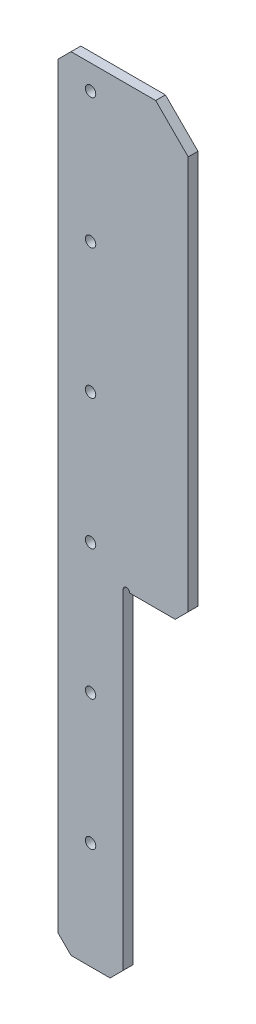
ISO-10303-21;
HEADER;
FILE_DESCRIPTION(('STEP AP214'),'2;1');
FILE_NAME('part.step','',(''),(''),'','','');
FILE_SCHEMA(('AUTOMOTIVE_DESIGN { 1 0 10303 214 1 1 1 1 }'));
ENDSEC;
DATA;
#1=APPLICATION_CONTEXT('core data for automotive mechanical design processes');
#2=APPLICATION_PROTOCOL_DEFINITION('international standard','automotive_design',2000,#1);
#3=PRODUCT_CONTEXT('',#1,'mechanical');
#4=PRODUCT('Part','Part','',(#3));
#5=PRODUCT_RELATED_PRODUCT_CATEGORY('part','',(#4));
#6=PRODUCT_DEFINITION_FORMATION('','',#4);
#7=PRODUCT_DEFINITION_CONTEXT('part definition',#1,'design');
#8=PRODUCT_DEFINITION('design','',#6,#7);
#9=PRODUCT_DEFINITION_SHAPE('','',#8);
#10=(LENGTH_UNIT() NAMED_UNIT(*) SI_UNIT(.MILLI.,.METRE.));
#11=(NAMED_UNIT(*) PLANE_ANGLE_UNIT() SI_UNIT($,.RADIAN.));
#12=(NAMED_UNIT(*) SI_UNIT($,.STERADIAN.) SOLID_ANGLE_UNIT());
#13=UNCERTAINTY_MEASURE_WITH_UNIT(LENGTH_MEASURE(1.E-05),#10,'distance_accuracy_value','');
#14=(GEOMETRIC_REPRESENTATION_CONTEXT(3) GLOBAL_UNCERTAINTY_ASSIGNED_CONTEXT((#13)) GLOBAL_UNIT_ASSIGNED_CONTEXT((#10,
#11,#12)) REPRESENTATION_CONTEXT('',''));
#15=CARTESIAN_POINT('',(0.,0.,0.));
#16=DIRECTION('',(0.,0.,1.));
#17=DIRECTION('',(1.,0.,0.));
#18=AXIS2_PLACEMENT_3D('',#15,#16,#17);
#19=CARTESIAN_POINT('',(-10.,-72.5,-1.5));
#20=DIRECTION('',(0.,0.,1.));
#21=DIRECTION('',(1.,0.,0.));
#22=AXIS2_PLACEMENT_3D('',#19,#20,#21);
#23=CYLINDRICAL_SURFACE('',#22,1.6);
#24=CARTESIAN_POINT('',(-10.,-72.5,-1.5));
#25=DIRECTION('',(0.,0.,1.));
#26=DIRECTION('',(1.,0.,0.));
#27=AXIS2_PLACEMENT_3D('',#24,#25,#26);
#28=CIRCLE('',#27,1.6);
#29=CARTESIAN_POINT('',(-8.40000000000002,-72.5,-1.5));
#30=VERTEX_POINT('',#29);
#31=EDGE_CURVE('E186',#30,#30,#28,.T.);
#32=ORIENTED_EDGE('',*,*,#31,.F.);
#33=EDGE_LOOP('',(#32));
#34=FACE_BOUND('',#33,.T.);
#35=CARTESIAN_POINT('',(-10.,-72.5,1.5));
#36=DIRECTION('',(0.,0.,1.));
#37=DIRECTION('',(1.,0.,0.));
#38=AXIS2_PLACEMENT_3D('',#35,#36,#37);
#39=CIRCLE('',#38,1.6);
#40=CARTESIAN_POINT('',(-8.40000000000002,-72.5,1.5));
#41=VERTEX_POINT('',#40);
#42=EDGE_CURVE('E189',#41,#41,#39,.T.);
#43=ORIENTED_EDGE('',*,*,#42,.T.);
#44=EDGE_LOOP('',(#43));
#45=FACE_BOUND('',#44,.T.);
#46=ADVANCED_FACE('F39',(#34,#45),#23,.F.);
#47=CARTESIAN_POINT('',(-10.,-32.5,-1.5));
#48=DIRECTION('',(0.,0.,1.));
#49=DIRECTION('',(1.,0.,0.));
#50=AXIS2_PLACEMENT_3D('',#47,#48,#49);
#51=CYLINDRICAL_SURFACE('',#50,1.6);
#52=CARTESIAN_POINT('',(-10.,-32.5,-1.5));
#53=DIRECTION('',(0.,0.,1.));
#54=DIRECTION('',(1.,0.,0.));
#55=AXIS2_PLACEMENT_3D('',#52,#53,#54);
#56=CIRCLE('',#55,1.6);
#57=CARTESIAN_POINT('',(-8.40000000000002,-32.5,-1.5));
#58=VERTEX_POINT('',#57);
#59=EDGE_CURVE('E180',#58,#58,#56,.T.);
#60=ORIENTED_EDGE('',*,*,#59,.F.);
#61=EDGE_LOOP('',(#60));
#62=FACE_BOUND('',#61,.T.);
#63=CARTESIAN_POINT('',(-10.,-32.5,1.5));
#64=DIRECTION('',(0.,0.,1.));
#65=DIRECTION('',(1.,0.,0.));
#66=AXIS2_PLACEMENT_3D('',#63,#64,#65);
#67=CIRCLE('',#66,1.6);
#68=CARTESIAN_POINT('',(-8.40000000000002,-32.5,1.5));
#69=VERTEX_POINT('',#68);
#70=EDGE_CURVE('E183',#69,#69,#67,.T.);
#71=ORIENTED_EDGE('',*,*,#70,.T.);
#72=EDGE_LOOP('',(#71));
#73=FACE_BOUND('',#72,.T.);
#74=ADVANCED_FACE('F292',(#62,#73),#51,.F.);
#75=CARTESIAN_POINT('',(-10.,7.50000000000001,-1.5));
#76=DIRECTION('',(0.,0.,1.));
#77=DIRECTION('',(1.,0.,0.));
#78=AXIS2_PLACEMENT_3D('',#75,#76,#77);
#79=CYLINDRICAL_SURFACE('',#78,1.6);
#80=CARTESIAN_POINT('',(-10.,7.50000000000001,-1.5));
#81=DIRECTION('',(0.,0.,1.));
#82=DIRECTION('',(1.,0.,0.));
#83=AXIS2_PLACEMENT_3D('',#80,#81,#82);
#84=CIRCLE('',#83,1.6);
#85=CARTESIAN_POINT('',(-8.40000000000001,7.50000000000001,-1.5));
#86=VERTEX_POINT('',#85);
#87=EDGE_CURVE('E174',#86,#86,#84,.T.);
#88=ORIENTED_EDGE('',*,*,#87,.F.);
#89=EDGE_LOOP('',(#88));
#90=FACE_BOUND('',#89,.T.);
#91=CARTESIAN_POINT('',(-10.,7.50000000000001,1.5));
#92=DIRECTION('',(0.,0.,1.));
#93=DIRECTION('',(1.,0.,0.));
#94=AXIS2_PLACEMENT_3D('',#91,#92,#93);
#95=CIRCLE('',#94,1.6);
#96=CARTESIAN_POINT('',(-8.40000000000001,7.50000000000001,1.5));
#97=VERTEX_POINT('',#96);
#98=EDGE_CURVE('E177',#97,#97,#95,.T.);
#99=ORIENTED_EDGE('',*,*,#98,.T.);
#100=EDGE_LOOP('',(#99));
#101=FACE_BOUND('',#100,.T.);
#102=ADVANCED_FACE('F298',(#90,#101),#79,.F.);
#103=CARTESIAN_POINT('',(-10.,47.5,-1.5));
#104=DIRECTION('',(0.,0.,1.));
#105=DIRECTION('',(1.,0.,0.));
#106=AXIS2_PLACEMENT_3D('',#103,#104,#105);
#107=CYLINDRICAL_SURFACE('',#106,1.6);
#108=CARTESIAN_POINT('',(-10.,47.5,-1.5));
#109=DIRECTION('',(0.,0.,1.));
#110=DIRECTION('',(1.,0.,0.));
#111=AXIS2_PLACEMENT_3D('',#108,#109,#110);
#112=CIRCLE('',#111,1.6);
#113=CARTESIAN_POINT('',(-8.40000000000001,47.5,-1.5));
#114=VERTEX_POINT('',#113);
#115=EDGE_CURVE('E167',#114,#114,#112,.T.);
#116=ORIENTED_EDGE('',*,*,#115,.F.);
#117=EDGE_LOOP('',(#116));
#118=FACE_BOUND('',#117,.T.);
#119=CARTESIAN_POINT('',(-10.,47.5,1.5));
#120=DIRECTION('',(0.,0.,1.));
#121=DIRECTION('',(1.,0.,0.));
#122=AXIS2_PLACEMENT_3D('',#119,#120,#121);
#123=CIRCLE('',#122,1.6);
#124=CARTESIAN_POINT('',(-8.40000000000001,47.5,1.5));
#125=VERTEX_POINT('',#124);
#126=EDGE_CURVE('E171',#125,#125,#123,.T.);
#127=ORIENTED_EDGE('',*,*,#126,.T.);
#128=EDGE_LOOP('',(#127));
#129=FACE_BOUND('',#128,.T.);
#130=ADVANCED_FACE('F359',(#118,#129),#107,.F.);
#131=CARTESIAN_POINT('',(20.,135.,1.5));
#132=DIRECTION('',(0.,-1.,0.));
#133=DIRECTION('',(0.,0.,-1.));
#134=AXIS2_PLACEMENT_3D('',#131,#132,#133);
#135=PLANE('',#134);
#136=DIRECTION('',(-1.,0.,0.));
#137=VECTOR('',#136,1.);
#138=CARTESIAN_POINT('',(20.,135.,-1.5));
#139=LINE('',#138,#137);
#140=CARTESIAN_POINT('',(10.,135.,-1.5));
#141=VERTEX_POINT('',#140);
#142=CARTESIAN_POINT('',(-16.,135.,-1.5));
#143=VERTEX_POINT('',#142);
#144=EDGE_CURVE('E253',#141,#143,#139,.T.);
#145=ORIENTED_EDGE('',*,*,#144,.T.);
#146=DIRECTION('',(0.,0.,1.));
#147=VECTOR('',#146,1.);
#148=CARTESIAN_POINT('',(-16.,135.,1.5));
#149=LINE('',#148,#147);
#150=CARTESIAN_POINT('',(-16.,135.,1.5));
#151=VERTEX_POINT('',#150);
#152=EDGE_CURVE('E11',#143,#151,#149,.T.);
#153=ORIENTED_EDGE('',*,*,#152,.T.);
#154=DIRECTION('',(-1.,0.,0.));
#155=VECTOR('',#154,1.);
#156=CARTESIAN_POINT('',(20.,135.,1.5));
#157=LINE('',#156,#155);
#158=CARTESIAN_POINT('',(10.,135.,1.5));
#159=VERTEX_POINT('',#158);
#160=EDGE_CURVE('E160',#159,#151,#157,.T.);
#161=ORIENTED_EDGE('',*,*,#160,.F.);
#162=DIRECTION('',(0.,0.,-1.));
#163=VECTOR('',#162,1.);
#164=CARTESIAN_POINT('',(10.,135.,1.5));
#165=LINE('',#164,#163);
#166=EDGE_CURVE('E192',#159,#141,#165,.T.);
#167=ORIENTED_EDGE('',*,*,#166,.T.);
#168=EDGE_LOOP('',(#145,#153,#161,#167));
#169=FACE_BOUND('',#168,.T.);
#170=ADVANCED_FACE('F333',(#169),#135,.F.);
#171=CARTESIAN_POINT('',(-20.,135.,1.5));
#172=DIRECTION('',(1.,0.,0.));
#173=DIRECTION('',(0.,1.,0.));
#174=AXIS2_PLACEMENT_3D('',#171,#172,#173);
#175=PLANE('',#174);
#176=DIRECTION('',(0.,-1.,0.));
#177=VECTOR('',#176,1.);
#178=CARTESIAN_POINT('',(-20.,135.,-1.5));
#179=LINE('',#178,#177);
#180=CARTESIAN_POINT('',(-20.,131.,-1.5));
#181=VERTEX_POINT('',#180);
#182=CARTESIAN_POINT('',(-20.,-101.4,-1.5));
#183=VERTEX_POINT('',#182);
#184=EDGE_CURVE('E240',#181,#183,#179,.T.);
#185=ORIENTED_EDGE('',*,*,#184,.T.);
#186=DIRECTION('',(0.,0.,1.));
#187=VECTOR('',#186,1.);
#188=CARTESIAN_POINT('',(-20.,-101.4,1.5));
#189=LINE('',#188,#187);
#190=CARTESIAN_POINT('',(-20.,-101.4,1.5));
#191=VERTEX_POINT('',#190);
#192=EDGE_CURVE('E48',#183,#191,#189,.T.);
#193=ORIENTED_EDGE('',*,*,#192,.T.);
#194=DIRECTION('',(0.,-1.,0.));
#195=VECTOR('',#194,1.);
#196=CARTESIAN_POINT('',(-20.,135.,1.5));
#197=LINE('',#196,#195);
#198=CARTESIAN_POINT('',(-20.,131.,1.5));
#199=VERTEX_POINT('',#198);
#200=EDGE_CURVE('E237',#199,#191,#197,.T.);
#201=ORIENTED_EDGE('',*,*,#200,.F.);
#202=DIRECTION('',(0.,0.,-1.));
#203=VECTOR('',#202,1.);
#204=CARTESIAN_POINT('',(-20.,131.,1.5));
#205=LINE('',#204,#203);
#206=EDGE_CURVE('E229',#199,#181,#205,.T.);
#207=ORIENTED_EDGE('',*,*,#206,.T.);
#208=EDGE_LOOP('',(#185,#193,#201,#207));
#209=FACE_BOUND('',#208,.T.);
#210=ADVANCED_FACE('F236',(#209),#175,.F.);
#211=CARTESIAN_POINT('',(-20.,-105.4,1.5));
#212=DIRECTION('',(0.,1.,0.));
#213=DIRECTION('',(0.,0.,1.));
#214=AXIS2_PLACEMENT_3D('',#211,#212,#213);
#215=PLANE('',#214);
#216=DIRECTION('',(1.,0.,0.));
#217=VECTOR('',#216,1.);
#218=CARTESIAN_POINT('',(-20.,-105.4,-1.5));
#219=LINE('',#218,#217);
#220=CARTESIAN_POINT('',(-16.,-105.4,-1.5));
#221=VERTEX_POINT('',#220);
#222=CARTESIAN_POINT('',(-4.,-105.4,-1.5));
#223=VERTEX_POINT('',#222);
#224=EDGE_CURVE('E162',#221,#223,#219,.T.);
#225=ORIENTED_EDGE('',*,*,#224,.T.);
#226=DIRECTION('',(0.,0.,1.));
#227=VECTOR('',#226,1.);
#228=CARTESIAN_POINT('',(-4.,-105.4,1.5));
#229=LINE('',#228,#227);
#230=CARTESIAN_POINT('',(-4.,-105.4,1.5));
#231=VERTEX_POINT('',#230);
#232=EDGE_CURVE('E63',#223,#231,#229,.T.);
#233=ORIENTED_EDGE('',*,*,#232,.T.);
#234=DIRECTION('',(1.,0.,0.));
#235=VECTOR('',#234,1.);
#236=CARTESIAN_POINT('',(-20.,-105.4,1.5));
#237=LINE('',#236,#235);
#238=CARTESIAN_POINT('',(-16.,-105.4,1.5));
#239=VERTEX_POINT('',#238);
#240=EDGE_CURVE('E247',#239,#231,#237,.T.);
#241=ORIENTED_EDGE('',*,*,#240,.F.);
#242=DIRECTION('',(0.,0.,-1.));
#243=VECTOR('',#242,1.);
#244=CARTESIAN_POINT('',(-16.,-105.4,1.5));
#245=LINE('',#244,#243);
#246=EDGE_CURVE('E225',#239,#221,#245,.T.);
#247=ORIENTED_EDGE('',*,*,#246,.T.);
#248=EDGE_LOOP('',(#225,#233,#241,#247));
#249=FACE_BOUND('',#248,.T.);
#250=ADVANCED_FACE('F252',(#249),#215,.F.);
#251=CARTESIAN_POINT('',(0.,-105.4,1.5));
#252=DIRECTION('',(-1.,0.,0.));
#253=DIRECTION('',(0.,0.,1.));
#254=AXIS2_PLACEMENT_3D('',#251,#252,#253);
#255=PLANE('',#254);
#256=DIRECTION('',(0.,1.,0.));
#257=VECTOR('',#256,1.);
#258=CARTESIAN_POINT('',(0.,-105.4,1.5));
#259=LINE('',#258,#257);
#260=CARTESIAN_POINT('',(0.,-101.4,1.5));
#261=VERTEX_POINT('',#260);
#262=CARTESIAN_POINT('',(0.,0.,1.5));
#263=VERTEX_POINT('',#262);
#264=EDGE_CURVE('E261',#261,#263,#259,.T.);
#265=ORIENTED_EDGE('',*,*,#264,.F.);
#266=DIRECTION('',(0.,0.,-1.));
#267=VECTOR('',#266,1.);
#268=CARTESIAN_POINT('',(0.,-101.4,1.5));
#269=LINE('',#268,#267);
#270=CARTESIAN_POINT('',(0.,-101.4,-1.5));
#271=VERTEX_POINT('',#270);
#272=EDGE_CURVE('E222',#261,#271,#269,.T.);
#273=ORIENTED_EDGE('',*,*,#272,.T.);
#274=DIRECTION('',(0.,1.,0.));
#275=VECTOR('',#274,1.);
#276=CARTESIAN_POINT('',(0.,-105.4,-1.5));
#277=LINE('',#276,#275);
#278=CARTESIAN_POINT('',(0.,0.,-1.5));
#279=VERTEX_POINT('',#278);
#280=EDGE_CURVE('E158',#271,#279,#277,.T.);
#281=ORIENTED_EDGE('',*,*,#280,.T.);
#282=DIRECTION('',(0.,0.,-1.));
#283=VECTOR('',#282,1.);
#284=CARTESIAN_POINT('',(0.,0.,1.5));
#285=LINE('',#284,#283);
#286=EDGE_CURVE('E136',#263,#279,#285,.T.);
#287=ORIENTED_EDGE('',*,*,#286,.F.);
#288=EDGE_LOOP('',(#265,#273,#281,#287));
#289=FACE_BOUND('',#288,.T.);
#290=ADVANCED_FACE('F277',(#289),#255,.F.);
#291=CARTESIAN_POINT('',(0.,0.,1.5));
#292=DIRECTION('',(0.,1.,0.));
#293=DIRECTION('',(0.,0.,1.));
#294=AXIS2_PLACEMENT_3D('',#291,#292,#293);
#295=PLANE('',#294);
#296=DIRECTION('',(1.,0.,0.));
#297=VECTOR('',#296,1.);
#298=CARTESIAN_POINT('',(0.,0.,1.5));
#299=LINE('',#298,#297);
#300=CARTESIAN_POINT('',(2.,0.,1.5));
#301=VERTEX_POINT('',#300);
#302=CARTESIAN_POINT('',(16.,0.,1.5));
#303=VERTEX_POINT('',#302);
#304=EDGE_CURVE('E149',#301,#303,#299,.T.);
#305=ORIENTED_EDGE('',*,*,#304,.F.);
#306=DIRECTION('',(0.,0.,1.));
#307=VECTOR('',#306,1.);
#308=CARTESIAN_POINT('',(2.,0.,-1.5));
#309=LINE('',#308,#307);
#310=CARTESIAN_POINT('',(2.,0.,-1.5));
#311=VERTEX_POINT('',#310);
#312=EDGE_CURVE('E133',#301,#311,#309,.F.);
#313=ORIENTED_EDGE('',*,*,#312,.T.);
#314=DIRECTION('',(1.,0.,0.));
#315=VECTOR('',#314,1.);
#316=CARTESIAN_POINT('',(0.,0.,-1.5));
#317=LINE('',#316,#315);
#318=CARTESIAN_POINT('',(16.,0.,-1.5));
#319=VERTEX_POINT('',#318);
#320=EDGE_CURVE('E147',#311,#319,#317,.T.);
#321=ORIENTED_EDGE('',*,*,#320,.T.);
#322=DIRECTION('',(0.,0.,1.));
#323=VECTOR('',#322,1.);
#324=CARTESIAN_POINT('',(16.,0.,1.5));
#325=LINE('',#324,#323);
#326=EDGE_CURVE('E213',#319,#303,#325,.T.);
#327=ORIENTED_EDGE('',*,*,#326,.T.);
#328=EDGE_LOOP('',(#305,#313,#321,#327));
#329=FACE_BOUND('',#328,.T.);
#330=ADVANCED_FACE('F145',(#329),#295,.F.);
#331=CARTESIAN_POINT('',(20.,0.,1.5));
#332=DIRECTION('',(-1.,0.,0.));
#333=DIRECTION('',(0.,0.,1.));
#334=AXIS2_PLACEMENT_3D('',#331,#332,#333);
#335=PLANE('',#334);
#336=DIRECTION('',(0.,1.,0.));
#337=VECTOR('',#336,1.);
#338=CARTESIAN_POINT('',(20.,0.,1.5));
#339=LINE('',#338,#337);
#340=CARTESIAN_POINT('',(20.,3.99999999999998,1.5));
#341=VERTEX_POINT('',#340);
#342=CARTESIAN_POINT('',(20.,125.,1.5));
#343=VERTEX_POINT('',#342);
#344=EDGE_CURVE('E168',#341,#343,#339,.T.);
#345=ORIENTED_EDGE('',*,*,#344,.F.);
#346=DIRECTION('',(0.,0.,-1.));
#347=VECTOR('',#346,1.);
#348=CARTESIAN_POINT('',(20.,3.99999999999998,1.5));
#349=LINE('',#348,#347);
#350=CARTESIAN_POINT('',(20.,3.99999999999998,-1.5));
#351=VERTEX_POINT('',#350);
#352=EDGE_CURVE('E203',#341,#351,#349,.T.);
#353=ORIENTED_EDGE('',*,*,#352,.T.);
#354=DIRECTION('',(0.,1.,0.));
#355=VECTOR('',#354,1.);
#356=CARTESIAN_POINT('',(20.,0.,-1.5));
#357=LINE('',#356,#355);
#358=CARTESIAN_POINT('',(20.,125.,-1.5));
#359=VERTEX_POINT('',#358);
#360=EDGE_CURVE('E157',#351,#359,#357,.T.);
#361=ORIENTED_EDGE('',*,*,#360,.T.);
#362=DIRECTION('',(0.,0.,1.));
#363=VECTOR('',#362,1.);
#364=CARTESIAN_POINT('',(20.,125.,1.5));
#365=LINE('',#364,#363);
#366=EDGE_CURVE('E198',#359,#343,#365,.T.);
#367=ORIENTED_EDGE('',*,*,#366,.T.);
#368=EDGE_LOOP('',(#345,#353,#361,#367));
#369=FACE_BOUND('',#368,.T.);
#370=ADVANCED_FACE('F338',(#369),#335,.F.);
#371=CARTESIAN_POINT('',(0.,0.,1.5));
#372=DIRECTION('',(0.,0.,1.));
#373=DIRECTION('',(1.,0.,0.));
#374=AXIS2_PLACEMENT_3D('',#371,#372,#373);
#375=PLANE('',#374);
#376=CARTESIAN_POINT('',(1.,0.,1.5));
#377=DIRECTION('',(0.,0.,1.));
#378=DIRECTION('',(1.,0.,0.));
#379=AXIS2_PLACEMENT_3D('',#376,#377,#378);
#380=CIRCLE('',#379,1.);
#381=EDGE_CURVE('E141',#301,#263,#380,.T.);
#382=ORIENTED_EDGE('',*,*,#381,.F.);
#383=ORIENTED_EDGE('',*,*,#304,.T.);
#384=DIRECTION('',(-0.707106781186548,-0.707106781186548,0.));
#385=VECTOR('',#384,1.);
#386=CARTESIAN_POINT('',(8.00000000000001,-8.00000000000001,1.5));
#387=LINE('',#386,#385);
#388=EDGE_CURVE('E220',#303,#341,#387,.F.);
#389=ORIENTED_EDGE('',*,*,#388,.T.);
#390=ORIENTED_EDGE('',*,*,#344,.T.);
#391=DIRECTION('',(0.707106781186548,-0.707106781186548,0.));
#392=VECTOR('',#391,1.);
#393=CARTESIAN_POINT('',(72.5,72.5,1.5));
#394=LINE('',#393,#392);
#395=EDGE_CURVE('E201',#343,#159,#394,.F.);
#396=ORIENTED_EDGE('',*,*,#395,.T.);
#397=ORIENTED_EDGE('',*,*,#160,.T.);
#398=DIRECTION('',(0.707106781186552,0.707106781186543,0.));
#399=VECTOR('',#398,1.);
#400=CARTESIAN_POINT('',(-75.4999999999999,75.5000000000009,1.5));
#401=LINE('',#400,#399);
#402=EDGE_CURVE('E215',#151,#199,#401,.F.);
#403=ORIENTED_EDGE('',*,*,#402,.T.);
#404=ORIENTED_EDGE('',*,*,#200,.T.);
#405=DIRECTION('',(-0.707106781186545,0.70710678118655,0.));
#406=VECTOR('',#405,1.);
#407=CARTESIAN_POINT('',(-60.7000000000001,-60.6999999999997,1.5));
#408=LINE('',#407,#406);
#409=EDGE_CURVE('E217',#191,#239,#408,.F.);
#410=ORIENTED_EDGE('',*,*,#409,.T.);
#411=ORIENTED_EDGE('',*,*,#240,.T.);
#412=DIRECTION('',(-0.707106781186548,-0.707106781186548,0.));
#413=VECTOR('',#412,1.);
#414=CARTESIAN_POINT('',(50.7,-50.7,1.5));
#415=LINE('',#414,#413);
#416=EDGE_CURVE('E55',#231,#261,#415,.F.);
#417=ORIENTED_EDGE('',*,*,#416,.T.);
#418=ORIENTED_EDGE('',*,*,#264,.T.);
#419=EDGE_LOOP('',(#382,#383,#389,#390,#396,#397,#403,#404,#410,#411,#417,#418));
#420=FACE_BOUND('',#419,.T.);
#421=CARTESIAN_POINT('',(-10.,87.5,1.5));
#422=DIRECTION('',(0.,0.,1.));
#423=DIRECTION('',(1.,0.,0.));
#424=AXIS2_PLACEMENT_3D('',#421,#422,#423);
#425=CIRCLE('',#424,1.6);
#426=CARTESIAN_POINT('',(-8.40000000000001,87.5,1.5));
#427=VERTEX_POINT('',#426);
#428=EDGE_CURVE('E268',#427,#427,#425,.T.);
#429=ORIENTED_EDGE('',*,*,#428,.F.);
#430=EDGE_LOOP('',(#429));
#431=FACE_BOUND('',#430,.T.);
#432=CARTESIAN_POINT('',(-10.,127.5,1.5));
#433=DIRECTION('',(0.,0.,1.));
#434=DIRECTION('',(1.,0.,0.));
#435=AXIS2_PLACEMENT_3D('',#432,#433,#434);
#436=CIRCLE('',#435,1.6);
#437=CARTESIAN_POINT('',(-8.4,127.5,1.5));
#438=VERTEX_POINT('',#437);
#439=EDGE_CURVE('E265',#438,#438,#436,.T.);
#440=ORIENTED_EDGE('',*,*,#439,.F.);
#441=EDGE_LOOP('',(#440));
#442=FACE_BOUND('',#441,.T.);
#443=ORIENTED_EDGE('',*,*,#126,.F.);
#444=EDGE_LOOP('',(#443));
#445=FACE_BOUND('',#444,.T.);
#446=ORIENTED_EDGE('',*,*,#98,.F.);
#447=EDGE_LOOP('',(#446));
#448=FACE_BOUND('',#447,.T.);
#449=ORIENTED_EDGE('',*,*,#70,.F.);
#450=EDGE_LOOP('',(#449));
#451=FACE_BOUND('',#450,.T.);
#452=ORIENTED_EDGE('',*,*,#42,.F.);
#453=EDGE_LOOP('',(#452));
#454=FACE_BOUND('',#453,.T.);
#455=ADVANCED_FACE('F243',(#420,#431,#442,#445,#448,#451,#454),#375,.T.);
#456=CARTESIAN_POINT('',(0.,0.,-1.5));
#457=DIRECTION('',(0.,0.,1.));
#458=DIRECTION('',(1.,0.,0.));
#459=AXIS2_PLACEMENT_3D('',#456,#457,#458);
#460=PLANE('',#459);
#461=CARTESIAN_POINT('',(-10.,87.5,-1.5));
#462=DIRECTION('',(0.,0.,1.));
#463=DIRECTION('',(1.,0.,0.));
#464=AXIS2_PLACEMENT_3D('',#461,#462,#463);
#465=CIRCLE('',#464,1.6);
#466=CARTESIAN_POINT('',(-8.40000000000001,87.5,-1.5));
#467=VERTEX_POINT('',#466);
#468=EDGE_CURVE('E150',#467,#467,#465,.T.);
#469=ORIENTED_EDGE('',*,*,#468,.T.);
#470=EDGE_LOOP('',(#469));
#471=FACE_BOUND('',#470,.T.);
#472=CARTESIAN_POINT('',(-10.,127.5,-1.5));
#473=DIRECTION('',(0.,0.,1.));
#474=DIRECTION('',(1.,0.,0.));
#475=AXIS2_PLACEMENT_3D('',#472,#473,#474);
#476=CIRCLE('',#475,1.6);
#477=CARTESIAN_POINT('',(-8.4,127.5,-1.5));
#478=VERTEX_POINT('',#477);
#479=EDGE_CURVE('E258',#478,#478,#476,.T.);
#480=ORIENTED_EDGE('',*,*,#479,.T.);
#481=EDGE_LOOP('',(#480));
#482=FACE_BOUND('',#481,.T.);
#483=ORIENTED_EDGE('',*,*,#320,.F.);
#484=CARTESIAN_POINT('',(1.,0.,-1.5));
#485=DIRECTION('',(0.,0.,1.));
#486=DIRECTION('',(1.,0.,0.));
#487=AXIS2_PLACEMENT_3D('',#484,#485,#486);
#488=CIRCLE('',#487,1.);
#489=EDGE_CURVE('E130',#311,#279,#488,.T.);
#490=ORIENTED_EDGE('',*,*,#489,.T.);
#491=ORIENTED_EDGE('',*,*,#280,.F.);
#492=DIRECTION('',(0.707106781186548,0.707106781186548,0.));
#493=VECTOR('',#492,1.);
#494=CARTESIAN_POINT('',(0.,-101.4,-1.5));
#495=LINE('',#494,#493);
#496=EDGE_CURVE('E210',#271,#223,#495,.F.);
#497=ORIENTED_EDGE('',*,*,#496,.T.);
#498=ORIENTED_EDGE('',*,*,#224,.F.);
#499=DIRECTION('',(0.707106781186545,-0.70710678118655,0.));
#500=VECTOR('',#499,1.);
#501=CARTESIAN_POINT('',(-16.,-105.4,-1.5));
#502=LINE('',#501,#500);
#503=EDGE_CURVE('E208',#221,#183,#502,.F.);
#504=ORIENTED_EDGE('',*,*,#503,.T.);
#505=ORIENTED_EDGE('',*,*,#184,.F.);
#506=DIRECTION('',(-0.707106781186552,-0.707106781186543,0.));
#507=VECTOR('',#506,1.);
#508=CARTESIAN_POINT('',(-20.,131.,-1.5));
#509=LINE('',#508,#507);
#510=EDGE_CURVE('E206',#181,#143,#509,.F.);
#511=ORIENTED_EDGE('',*,*,#510,.T.);
#512=ORIENTED_EDGE('',*,*,#144,.F.);
#513=DIRECTION('',(-0.707106781186548,0.707106781186548,0.));
#514=VECTOR('',#513,1.);
#515=CARTESIAN_POINT('',(10.,135.,-1.5));
#516=LINE('',#515,#514);
#517=EDGE_CURVE('E195',#141,#359,#516,.F.);
#518=ORIENTED_EDGE('',*,*,#517,.T.);
#519=ORIENTED_EDGE('',*,*,#360,.F.);
#520=DIRECTION('',(0.707106781186548,0.707106781186548,0.));
#521=VECTOR('',#520,1.);
#522=CARTESIAN_POINT('',(20.,3.99999999999998,-1.5));
#523=LINE('',#522,#521);
#524=EDGE_CURVE('E155',#351,#319,#523,.F.);
#525=ORIENTED_EDGE('',*,*,#524,.T.);
#526=EDGE_LOOP('',(#483,#490,#491,#497,#498,#504,#505,#511,#512,#518,#519,#525));
#527=FACE_BOUND('',#526,.T.);
#528=ORIENTED_EDGE('',*,*,#115,.T.);
#529=EDGE_LOOP('',(#528));
#530=FACE_BOUND('',#529,.T.);
#531=ORIENTED_EDGE('',*,*,#87,.T.);
#532=EDGE_LOOP('',(#531));
#533=FACE_BOUND('',#532,.T.);
#534=ORIENTED_EDGE('',*,*,#59,.T.);
#535=EDGE_LOOP('',(#534));
#536=FACE_BOUND('',#535,.T.);
#537=ORIENTED_EDGE('',*,*,#31,.T.);
#538=EDGE_LOOP('',(#537));
#539=FACE_BOUND('',#538,.T.);
#540=ADVANCED_FACE('F152',(#471,#482,#527,#530,#533,#536,#539),#460,.F.);
#541=CARTESIAN_POINT('',(-10.,127.5,-1.5));
#542=DIRECTION('',(0.,0.,1.));
#543=DIRECTION('',(1.,0.,0.));
#544=AXIS2_PLACEMENT_3D('',#541,#542,#543);
#545=CYLINDRICAL_SURFACE('',#544,1.6);
#546=ORIENTED_EDGE('',*,*,#479,.F.);
#547=EDGE_LOOP('',(#546));
#548=FACE_BOUND('',#547,.T.);
#549=ORIENTED_EDGE('',*,*,#439,.T.);
#550=EDGE_LOOP('',(#549));
#551=FACE_BOUND('',#550,.T.);
#552=ADVANCED_FACE('F324',(#548,#551),#545,.F.);
#553=CARTESIAN_POINT('',(-10.,87.5,-1.5));
#554=DIRECTION('',(0.,0.,1.));
#555=DIRECTION('',(1.,0.,0.));
#556=AXIS2_PLACEMENT_3D('',#553,#554,#555);
#557=CYLINDRICAL_SURFACE('',#556,1.6);
#558=ORIENTED_EDGE('',*,*,#468,.F.);
#559=EDGE_LOOP('',(#558));
#560=FACE_BOUND('',#559,.T.);
#561=ORIENTED_EDGE('',*,*,#428,.T.);
#562=EDGE_LOOP('',(#561));
#563=FACE_BOUND('',#562,.T.);
#564=ADVANCED_FACE('F310',(#560,#563),#557,.F.);
#565=CARTESIAN_POINT('',(10.,135.,1.5));
#566=DIRECTION('',(-0.707106781186547,-0.707106781186547,0.));
#567=DIRECTION('',(0.,0.,-1.));
#568=AXIS2_PLACEMENT_3D('',#565,#566,#567);
#569=PLANE('',#568);
#570=ORIENTED_EDGE('',*,*,#395,.F.);
#571=ORIENTED_EDGE('',*,*,#366,.F.);
#572=ORIENTED_EDGE('',*,*,#517,.F.);
#573=ORIENTED_EDGE('',*,*,#166,.F.);
#574=EDGE_LOOP('',(#570,#571,#572,#573));
#575=FACE_BOUND('',#574,.T.);
#576=ADVANCED_FACE('F287',(#575),#569,.F.);
#577=CARTESIAN_POINT('',(20.,3.99999999999998,1.5));
#578=DIRECTION('',(-0.707106781186547,0.707106781186547,0.));
#579=DIRECTION('',(0.,0.,-1.));
#580=AXIS2_PLACEMENT_3D('',#577,#578,#579);
#581=PLANE('',#580);
#582=ORIENTED_EDGE('',*,*,#388,.F.);
#583=ORIENTED_EDGE('',*,*,#326,.F.);
#584=ORIENTED_EDGE('',*,*,#524,.F.);
#585=ORIENTED_EDGE('',*,*,#352,.F.);
#586=EDGE_LOOP('',(#582,#583,#584,#585));
#587=FACE_BOUND('',#586,.T.);
#588=ADVANCED_FACE('F281',(#587),#581,.F.);
#589=CARTESIAN_POINT('',(0.,-101.4,1.5));
#590=DIRECTION('',(-0.707106781186547,0.707106781186547,0.));
#591=DIRECTION('',(0.,0.,-1.));
#592=AXIS2_PLACEMENT_3D('',#589,#590,#591);
#593=PLANE('',#592);
#594=ORIENTED_EDGE('',*,*,#416,.F.);
#595=ORIENTED_EDGE('',*,*,#232,.F.);
#596=ORIENTED_EDGE('',*,*,#496,.F.);
#597=ORIENTED_EDGE('',*,*,#272,.F.);
#598=EDGE_LOOP('',(#594,#595,#596,#597));
#599=FACE_BOUND('',#598,.T.);
#600=ADVANCED_FACE('F279',(#599),#593,.F.);
#601=CARTESIAN_POINT('',(-16.,-105.4,1.5));
#602=DIRECTION('',(0.70710678118655,0.707106781186545,0.));
#603=DIRECTION('',(0.,0.,-1.));
#604=AXIS2_PLACEMENT_3D('',#601,#602,#603);
#605=PLANE('',#604);
#606=ORIENTED_EDGE('',*,*,#409,.F.);
#607=ORIENTED_EDGE('',*,*,#192,.F.);
#608=ORIENTED_EDGE('',*,*,#503,.F.);
#609=ORIENTED_EDGE('',*,*,#246,.F.);
#610=EDGE_LOOP('',(#606,#607,#608,#609));
#611=FACE_BOUND('',#610,.T.);
#612=ADVANCED_FACE('F250',(#611),#605,.F.);
#613=CARTESIAN_POINT('',(-20.,131.,1.5));
#614=DIRECTION('',(0.707106781186543,-0.707106781186552,0.));
#615=DIRECTION('',(0.,0.,-1.));
#616=AXIS2_PLACEMENT_3D('',#613,#614,#615);
#617=PLANE('',#616);
#618=ORIENTED_EDGE('',*,*,#402,.F.);
#619=ORIENTED_EDGE('',*,*,#152,.F.);
#620=ORIENTED_EDGE('',*,*,#510,.F.);
#621=ORIENTED_EDGE('',*,*,#206,.F.);
#622=EDGE_LOOP('',(#618,#619,#620,#621));
#623=FACE_BOUND('',#622,.T.);
#624=ADVANCED_FACE('F42',(#623),#617,.F.);
#625=CARTESIAN_POINT('',(1.,0.,-1.5));
#626=DIRECTION('',(0.,0.,1.));
#627=DIRECTION('',(1.,0.,0.));
#628=AXIS2_PLACEMENT_3D('',#625,#626,#627);
#629=CYLINDRICAL_SURFACE('',#628,1.);
#630=ORIENTED_EDGE('',*,*,#489,.F.);
#631=ORIENTED_EDGE('',*,*,#312,.F.);
#632=ORIENTED_EDGE('',*,*,#381,.T.);
#633=ORIENTED_EDGE('',*,*,#286,.T.);
#634=EDGE_LOOP('',(#630,#631,#632,#633));
#635=FACE_BOUND('',#634,.T.);
#636=ADVANCED_FACE('F132',(#635),#629,.F.);
#637=CLOSED_SHELL('',(#46,#74,#102,#130,#170,#210,#250,#290,#330,#370,#455,#540,#552,#564,#576,
#588,#600,#612,#624,#636));
#638=MANIFOLD_SOLID_BREP('B2',#637);
#639=ADVANCED_BREP_SHAPE_REPRESENTATION('',(#18,#638),#14);
#640=SHAPE_DEFINITION_REPRESENTATION(#9,#639);
ENDSEC;
END-ISO-10303-21;
